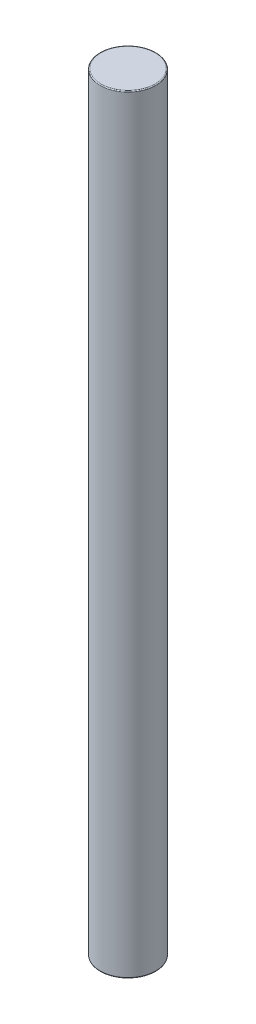
ISO-10303-21;
HEADER;
FILE_DESCRIPTION(('STEP AP214'),'2;1');
FILE_NAME('part.step','',(''),(''),'','','');
FILE_SCHEMA(('AUTOMOTIVE_DESIGN { 1 0 10303 214 1 1 1 1 }'));
ENDSEC;
DATA;
#1=APPLICATION_CONTEXT('core data for automotive mechanical design processes');
#2=APPLICATION_PROTOCOL_DEFINITION('international standard','automotive_design',2000,#1);
#3=PRODUCT_CONTEXT('',#1,'mechanical');
#4=PRODUCT('Part','Part','',(#3));
#5=PRODUCT_RELATED_PRODUCT_CATEGORY('part','',(#4));
#6=PRODUCT_DEFINITION_FORMATION('','',#4);
#7=PRODUCT_DEFINITION_CONTEXT('part definition',#1,'design');
#8=PRODUCT_DEFINITION('design','',#6,#7);
#9=PRODUCT_DEFINITION_SHAPE('','',#8);
#10=(LENGTH_UNIT() NAMED_UNIT(*) SI_UNIT(.MILLI.,.METRE.));
#11=(NAMED_UNIT(*) PLANE_ANGLE_UNIT() SI_UNIT($,.RADIAN.));
#12=(NAMED_UNIT(*) SI_UNIT($,.STERADIAN.) SOLID_ANGLE_UNIT());
#13=UNCERTAINTY_MEASURE_WITH_UNIT(LENGTH_MEASURE(1.E-05),#10,'distance_accuracy_value','');
#14=(GEOMETRIC_REPRESENTATION_CONTEXT(3) GLOBAL_UNCERTAINTY_ASSIGNED_CONTEXT((#13)) GLOBAL_UNIT_ASSIGNED_CONTEXT((#10,
#11,#12)) REPRESENTATION_CONTEXT('',''));
#15=CARTESIAN_POINT('',(0.,0.,0.));
#16=DIRECTION('',(0.,0.,1.));
#17=DIRECTION('',(1.,0.,0.));
#18=AXIS2_PLACEMENT_3D('',#15,#16,#17);
#19=CARTESIAN_POINT('',(0.,82.5,0.));
#20=DIRECTION('',(0.,-1.,0.));
#21=DIRECTION('',(0.,0.,-1.));
#22=AXIS2_PLACEMENT_3D('',#19,#20,#21);
#23=CYLINDRICAL_SURFACE('',#22,6.);
#24=CARTESIAN_POINT('',(0.,-82.3,0.));
#25=DIRECTION('',(0.,1.,0.));
#26=DIRECTION('',(0.,0.,1.));
#27=AXIS2_PLACEMENT_3D('',#24,#25,#26);
#28=CIRCLE('',#27,6.);
#29=CARTESIAN_POINT('',(0.,-82.3,6.));
#30=VERTEX_POINT('',#29);
#31=EDGE_CURVE('E50',#30,#30,#28,.T.);
#32=ORIENTED_EDGE('',*,*,#31,.T.);
#33=EDGE_LOOP('',(#32));
#34=FACE_BOUND('',#33,.T.);
#35=CARTESIAN_POINT('',(0.,82.3,0.));
#36=DIRECTION('',(0.,1.,0.));
#37=DIRECTION('',(0.,0.,1.));
#38=AXIS2_PLACEMENT_3D('',#35,#36,#37);
#39=CIRCLE('',#38,6.);
#40=CARTESIAN_POINT('',(0.,82.3,6.));
#41=VERTEX_POINT('',#40);
#42=EDGE_CURVE('E55',#41,#41,#39,.F.);
#43=ORIENTED_EDGE('',*,*,#42,.T.);
#44=EDGE_LOOP('',(#43));
#45=FACE_BOUND('',#44,.T.);
#46=ADVANCED_FACE('F37',(#34,#45),#23,.T.);
#47=CARTESIAN_POINT('',(0.,82.5,0.));
#48=DIRECTION('',(0.,1.,0.));
#49=DIRECTION('',(0.,0.,1.));
#50=AXIS2_PLACEMENT_3D('',#47,#48,#49);
#51=PLANE('',#50);
#52=CARTESIAN_POINT('',(0.,82.5,0.));
#53=DIRECTION('',(0.,1.,0.));
#54=DIRECTION('',(0.,0.,1.));
#55=AXIS2_PLACEMENT_3D('',#52,#53,#54);
#56=CIRCLE('',#55,5.8);
#57=CARTESIAN_POINT('',(0.,82.5,5.8));
#58=VERTEX_POINT('',#57);
#59=EDGE_CURVE('E10',#58,#58,#56,.T.);
#60=ORIENTED_EDGE('',*,*,#59,.T.);
#61=EDGE_LOOP('',(#60));
#62=FACE_BOUND('',#61,.T.);
#63=ADVANCED_FACE('F72',(#62),#51,.T.);
#64=CARTESIAN_POINT('',(0.,-82.5,0.));
#65=DIRECTION('',(0.,1.,0.));
#66=DIRECTION('',(0.,0.,1.));
#67=AXIS2_PLACEMENT_3D('',#64,#65,#66);
#68=PLANE('',#67);
#69=CARTESIAN_POINT('',(0.,-82.5,0.));
#70=DIRECTION('',(0.,1.,0.));
#71=DIRECTION('',(0.,0.,1.));
#72=AXIS2_PLACEMENT_3D('',#69,#70,#71);
#73=CIRCLE('',#72,5.8);
#74=CARTESIAN_POINT('',(0.,-82.5,5.8));
#75=VERTEX_POINT('',#74);
#76=EDGE_CURVE('E45',#75,#75,#73,.F.);
#77=ORIENTED_EDGE('',*,*,#76,.T.);
#78=EDGE_LOOP('',(#77));
#79=FACE_BOUND('',#78,.T.);
#80=ADVANCED_FACE('F69',(#79),#68,.F.);
#81=CARTESIAN_POINT('',(0.,-82.3,0.));
#82=DIRECTION('',(0.,1.,0.));
#83=DIRECTION('',(0.,0.,1.));
#84=AXIS2_PLACEMENT_3D('',#81,#82,#83);
#85=TOROIDAL_SURFACE('',#84,5.8,0.2);
#86=ORIENTED_EDGE('',*,*,#76,.F.);
#87=EDGE_LOOP('',(#86));
#88=FACE_BOUND('',#87,.T.);
#89=ORIENTED_EDGE('',*,*,#31,.F.);
#90=EDGE_LOOP('',(#89));
#91=FACE_BOUND('',#90,.T.);
#92=ADVANCED_FACE('F65',(#88,#91),#85,.T.);
#93=CARTESIAN_POINT('',(0.,82.3,0.));
#94=DIRECTION('',(0.,1.,0.));
#95=DIRECTION('',(0.,0.,1.));
#96=AXIS2_PLACEMENT_3D('',#93,#94,#95);
#97=TOROIDAL_SURFACE('',#96,5.8,0.2);
#98=ORIENTED_EDGE('',*,*,#42,.F.);
#99=EDGE_LOOP('',(#98));
#100=FACE_BOUND('',#99,.T.);
#101=ORIENTED_EDGE('',*,*,#59,.F.);
#102=EDGE_LOOP('',(#101));
#103=FACE_BOUND('',#102,.T.);
#104=ADVANCED_FACE('F39',(#100,#103),#97,.T.);
#105=CLOSED_SHELL('',(#46,#63,#80,#92,#104));
#106=MANIFOLD_SOLID_BREP('B2',#105);
#107=ADVANCED_BREP_SHAPE_REPRESENTATION('',(#18,#106),#14);
#108=SHAPE_DEFINITION_REPRESENTATION(#9,#107);
ENDSEC;
END-ISO-10303-21;
